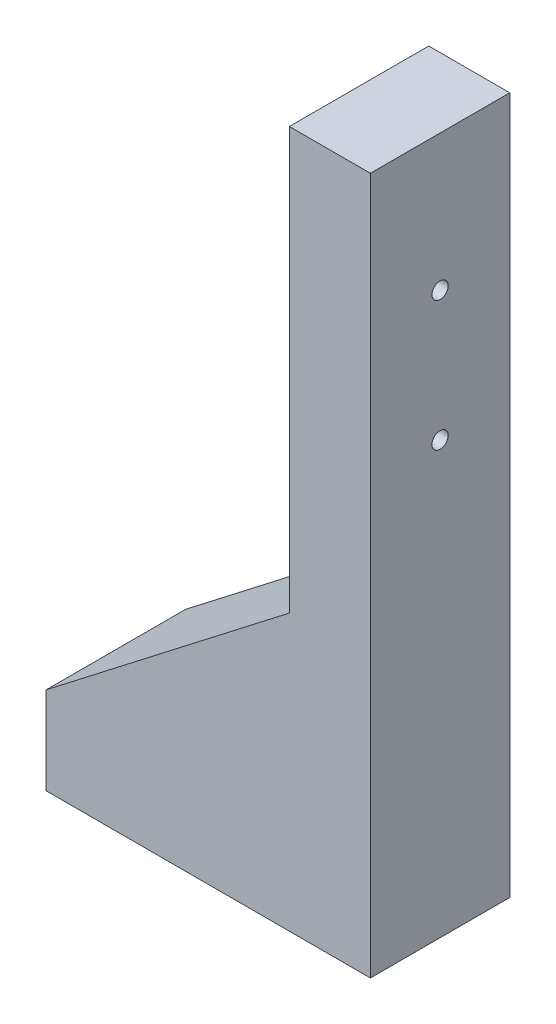
ISO-10303-21;
HEADER;
FILE_DESCRIPTION(('STEP AP214'),'2;1');
FILE_NAME('part.step','',(''),(''),'','','');
FILE_SCHEMA(('AUTOMOTIVE_DESIGN { 1 0 10303 214 1 1 1 1 }'));
ENDSEC;
DATA;
#1=APPLICATION_CONTEXT('core data for automotive mechanical design processes');
#2=APPLICATION_PROTOCOL_DEFINITION('international standard','automotive_design',2000,#1);
#3=PRODUCT_CONTEXT('',#1,'mechanical');
#4=PRODUCT('Part','Part','',(#3));
#5=PRODUCT_RELATED_PRODUCT_CATEGORY('part','',(#4));
#6=PRODUCT_DEFINITION_FORMATION('','',#4);
#7=PRODUCT_DEFINITION_CONTEXT('part definition',#1,'design');
#8=PRODUCT_DEFINITION('design','',#6,#7);
#9=PRODUCT_DEFINITION_SHAPE('','',#8);
#10=(LENGTH_UNIT() NAMED_UNIT(*) SI_UNIT(.MILLI.,.METRE.));
#11=(NAMED_UNIT(*) PLANE_ANGLE_UNIT() SI_UNIT($,.RADIAN.));
#12=(NAMED_UNIT(*) SI_UNIT($,.STERADIAN.) SOLID_ANGLE_UNIT());
#13=UNCERTAINTY_MEASURE_WITH_UNIT(LENGTH_MEASURE(1.E-05),#10,'distance_accuracy_value','');
#14=(GEOMETRIC_REPRESENTATION_CONTEXT(3) GLOBAL_UNCERTAINTY_ASSIGNED_CONTEXT((#13)) GLOBAL_UNIT_ASSIGNED_CONTEXT((#10,
#11,#12)) REPRESENTATION_CONTEXT('',''));
#15=CARTESIAN_POINT('',(0.,0.,0.));
#16=DIRECTION('',(0.,0.,1.));
#17=DIRECTION('',(1.,0.,0.));
#18=AXIS2_PLACEMENT_3D('',#15,#16,#17);
#19=CARTESIAN_POINT('',(-75.,-58.,43.));
#20=DIRECTION('',(0.611747641047043,-0.791052984112555,0.));
#21=DIRECTION('',(0.791052984112555,0.611747641047043,0.));
#22=AXIS2_PLACEMENT_3D('',#19,#20,#21);
#23=PLANE('',#22);
#24=DIRECTION('',(-0.791052984112555,-0.611747641047043,0.));
#25=VECTOR('',#24,1.);
#26=CARTESIAN_POINT('',(-75.,-58.,0.));
#27=LINE('',#26,#25);
#28=CARTESIAN_POINT('',(0.,0.,0.));
#29=VERTEX_POINT('',#28);
#30=CARTESIAN_POINT('',(-75.,-58.,0.));
#31=VERTEX_POINT('',#30);
#32=EDGE_CURVE('E117',#29,#31,#27,.T.);
#33=ORIENTED_EDGE('',*,*,#32,.T.);
#34=DIRECTION('',(0.,0.,-1.));
#35=VECTOR('',#34,1.);
#36=CARTESIAN_POINT('',(-75.,-58.,43.));
#37=LINE('',#36,#35);
#38=CARTESIAN_POINT('',(-75.,-58.,43.));
#39=VERTEX_POINT('',#38);
#40=EDGE_CURVE('E11',#39,#31,#37,.T.);
#41=ORIENTED_EDGE('',*,*,#40,.F.);
#42=DIRECTION('',(-0.791052984112555,-0.611747641047043,0.));
#43=VECTOR('',#42,1.);
#44=CARTESIAN_POINT('',(-75.,-58.,43.));
#45=LINE('',#44,#43);
#46=CARTESIAN_POINT('',(0.,0.,43.));
#47=VERTEX_POINT('',#46);
#48=EDGE_CURVE('E128',#47,#39,#45,.T.);
#49=ORIENTED_EDGE('',*,*,#48,.F.);
#50=DIRECTION('',(0.,0.,-1.));
#51=VECTOR('',#50,1.);
#52=CARTESIAN_POINT('',(0.,0.,43.));
#53=LINE('',#52,#51);
#54=EDGE_CURVE('E113',#47,#29,#53,.T.);
#55=ORIENTED_EDGE('',*,*,#54,.T.);
#56=EDGE_LOOP('',(#33,#41,#49,#55));
#57=FACE_BOUND('',#56,.T.);
#58=ADVANCED_FACE('F33',(#57),#23,.F.);
#59=CARTESIAN_POINT('',(-75.,-85.,43.));
#60=DIRECTION('',(1.,0.,0.));
#61=DIRECTION('',(0.,0.,-1.));
#62=AXIS2_PLACEMENT_3D('',#59,#60,#61);
#63=PLANE('',#62);
#64=DIRECTION('',(0.,-1.,0.));
#65=VECTOR('',#64,1.);
#66=CARTESIAN_POINT('',(-75.,-85.,0.));
#67=LINE('',#66,#65);
#68=CARTESIAN_POINT('',(-75.,-85.,0.));
#69=VERTEX_POINT('',#68);
#70=EDGE_CURVE('E120',#31,#69,#67,.T.);
#71=ORIENTED_EDGE('',*,*,#70,.T.);
#72=DIRECTION('',(0.,0.,-1.));
#73=VECTOR('',#72,1.);
#74=CARTESIAN_POINT('',(-75.,-85.,43.));
#75=LINE('',#74,#73);
#76=CARTESIAN_POINT('',(-75.,-85.,43.));
#77=VERTEX_POINT('',#76);
#78=EDGE_CURVE('E41',#77,#69,#75,.T.);
#79=ORIENTED_EDGE('',*,*,#78,.F.);
#80=DIRECTION('',(0.,-1.,0.));
#81=VECTOR('',#80,1.);
#82=CARTESIAN_POINT('',(-75.,-85.,43.));
#83=LINE('',#82,#81);
#84=EDGE_CURVE('E86',#39,#77,#83,.T.);
#85=ORIENTED_EDGE('',*,*,#84,.F.);
#86=ORIENTED_EDGE('',*,*,#40,.T.);
#87=EDGE_LOOP('',(#71,#79,#85,#86));
#88=FACE_BOUND('',#87,.T.);
#89=ADVANCED_FACE('F155',(#88),#63,.F.);
#90=CARTESIAN_POINT('',(25.,-85.,43.));
#91=DIRECTION('',(0.,1.,0.));
#92=DIRECTION('',(-1.,0.,0.));
#93=AXIS2_PLACEMENT_3D('',#90,#91,#92);
#94=PLANE('',#93);
#95=DIRECTION('',(1.,0.,0.));
#96=VECTOR('',#95,1.);
#97=CARTESIAN_POINT('',(25.,-85.,0.));
#98=LINE('',#97,#96);
#99=CARTESIAN_POINT('',(25.,-85.,0.));
#100=VERTEX_POINT('',#99);
#101=EDGE_CURVE('E123',#69,#100,#98,.T.);
#102=ORIENTED_EDGE('',*,*,#101,.T.);
#103=DIRECTION('',(0.,0.,-1.));
#104=VECTOR('',#103,1.);
#105=CARTESIAN_POINT('',(25.,-85.,43.));
#106=LINE('',#105,#104);
#107=CARTESIAN_POINT('',(25.,-85.,43.));
#108=VERTEX_POINT('',#107);
#109=EDGE_CURVE('E108',#108,#100,#106,.T.);
#110=ORIENTED_EDGE('',*,*,#109,.F.);
#111=DIRECTION('',(1.,0.,0.));
#112=VECTOR('',#111,1.);
#113=CARTESIAN_POINT('',(25.,-85.,43.));
#114=LINE('',#113,#112);
#115=EDGE_CURVE('E99',#77,#108,#114,.T.);
#116=ORIENTED_EDGE('',*,*,#115,.F.);
#117=ORIENTED_EDGE('',*,*,#78,.T.);
#118=EDGE_LOOP('',(#102,#110,#116,#117));
#119=FACE_BOUND('',#118,.T.);
#120=ADVANCED_FACE('F134',(#119),#94,.F.);
#121=CARTESIAN_POINT('',(25.,130.,43.));
#122=DIRECTION('',(-1.,0.,0.));
#123=DIRECTION('',(0.,-1.,0.));
#124=AXIS2_PLACEMENT_3D('',#121,#122,#123);
#125=PLANE('',#124);
#126=CARTESIAN_POINT('',(25.,88.,21.5));
#127=DIRECTION('',(-1.,0.,0.));
#128=DIRECTION('',(0.,0.,1.));
#129=AXIS2_PLACEMENT_3D('',#126,#127,#128);
#130=CIRCLE('',#129,2.5);
#131=CARTESIAN_POINT('',(25.,88.,24.));
#132=VERTEX_POINT('',#131);
#133=EDGE_CURVE('E121',#132,#132,#130,.T.);
#134=ORIENTED_EDGE('',*,*,#133,.T.);
#135=EDGE_LOOP('',(#134));
#136=FACE_BOUND('',#135,.T.);
#137=CARTESIAN_POINT('',(25.,48.,21.5));
#138=DIRECTION('',(-1.,0.,0.));
#139=DIRECTION('',(0.,0.,1.));
#140=AXIS2_PLACEMENT_3D('',#137,#138,#139);
#141=CIRCLE('',#140,2.5);
#142=CARTESIAN_POINT('',(25.,48.,24.));
#143=VERTEX_POINT('',#142);
#144=EDGE_CURVE('E173',#143,#143,#141,.T.);
#145=ORIENTED_EDGE('',*,*,#144,.T.);
#146=EDGE_LOOP('',(#145));
#147=FACE_BOUND('',#146,.T.);
#148=DIRECTION('',(0.,1.,0.));
#149=VECTOR('',#148,1.);
#150=CARTESIAN_POINT('',(25.,130.,0.));
#151=LINE('',#150,#149);
#152=CARTESIAN_POINT('',(25.,130.,0.));
#153=VERTEX_POINT('',#152);
#154=EDGE_CURVE('E107',#100,#153,#151,.T.);
#155=ORIENTED_EDGE('',*,*,#154,.T.);
#156=DIRECTION('',(0.,0.,-1.));
#157=VECTOR('',#156,1.);
#158=CARTESIAN_POINT('',(25.,130.,43.));
#159=LINE('',#158,#157);
#160=CARTESIAN_POINT('',(25.,130.,43.));
#161=VERTEX_POINT('',#160);
#162=EDGE_CURVE('E104',#161,#153,#159,.T.);
#163=ORIENTED_EDGE('',*,*,#162,.F.);
#164=DIRECTION('',(0.,1.,0.));
#165=VECTOR('',#164,1.);
#166=CARTESIAN_POINT('',(25.,130.,43.));
#167=LINE('',#166,#165);
#168=EDGE_CURVE('E93',#108,#161,#167,.T.);
#169=ORIENTED_EDGE('',*,*,#168,.F.);
#170=ORIENTED_EDGE('',*,*,#109,.T.);
#171=EDGE_LOOP('',(#155,#163,#169,#170));
#172=FACE_BOUND('',#171,.T.);
#173=ADVANCED_FACE('F105',(#136,#147,#172),#125,.F.);
#174=CARTESIAN_POINT('',(0.,130.,43.));
#175=DIRECTION('',(0.,-1.,0.));
#176=DIRECTION('',(0.,0.,-1.));
#177=AXIS2_PLACEMENT_3D('',#174,#175,#176);
#178=PLANE('',#177);
#179=DIRECTION('',(-1.,0.,0.));
#180=VECTOR('',#179,1.);
#181=CARTESIAN_POINT('',(0.,130.,0.));
#182=LINE('',#181,#180);
#183=CARTESIAN_POINT('',(0.,130.,0.));
#184=VERTEX_POINT('',#183);
#185=EDGE_CURVE('E72',#153,#184,#182,.T.);
#186=ORIENTED_EDGE('',*,*,#185,.T.);
#187=DIRECTION('',(0.,0.,-1.));
#188=VECTOR('',#187,1.);
#189=CARTESIAN_POINT('',(0.,130.,43.));
#190=LINE('',#189,#188);
#191=CARTESIAN_POINT('',(0.,130.,43.));
#192=VERTEX_POINT('',#191);
#193=EDGE_CURVE('E109',#192,#184,#190,.T.);
#194=ORIENTED_EDGE('',*,*,#193,.F.);
#195=DIRECTION('',(-1.,0.,0.));
#196=VECTOR('',#195,1.);
#197=CARTESIAN_POINT('',(0.,130.,43.));
#198=LINE('',#197,#196);
#199=EDGE_CURVE('E97',#161,#192,#198,.T.);
#200=ORIENTED_EDGE('',*,*,#199,.F.);
#201=ORIENTED_EDGE('',*,*,#162,.T.);
#202=EDGE_LOOP('',(#186,#194,#200,#201));
#203=FACE_BOUND('',#202,.T.);
#204=ADVANCED_FACE('F111',(#203),#178,.F.);
#205=CARTESIAN_POINT('',(0.,0.,43.));
#206=DIRECTION('',(1.,0.,0.));
#207=DIRECTION('',(0.,0.,-1.));
#208=AXIS2_PLACEMENT_3D('',#205,#206,#207);
#209=PLANE('',#208);
#210=CARTESIAN_POINT('',(0.,88.,21.5));
#211=DIRECTION('',(-1.,0.,0.));
#212=DIRECTION('',(0.,0.,1.));
#213=AXIS2_PLACEMENT_3D('',#210,#211,#212);
#214=CIRCLE('',#213,2.5);
#215=CARTESIAN_POINT('',(0.,88.,24.));
#216=VERTEX_POINT('',#215);
#217=EDGE_CURVE('E175',#216,#216,#214,.T.);
#218=ORIENTED_EDGE('',*,*,#217,.F.);
#219=EDGE_LOOP('',(#218));
#220=FACE_BOUND('',#219,.T.);
#221=CARTESIAN_POINT('',(0.,48.,21.5));
#222=DIRECTION('',(-1.,0.,0.));
#223=DIRECTION('',(0.,0.,1.));
#224=AXIS2_PLACEMENT_3D('',#221,#222,#223);
#225=CIRCLE('',#224,2.5);
#226=CARTESIAN_POINT('',(0.,48.,24.));
#227=VERTEX_POINT('',#226);
#228=EDGE_CURVE('E176',#227,#227,#225,.T.);
#229=ORIENTED_EDGE('',*,*,#228,.F.);
#230=EDGE_LOOP('',(#229));
#231=FACE_BOUND('',#230,.T.);
#232=DIRECTION('',(0.,-1.,0.));
#233=VECTOR('',#232,1.);
#234=CARTESIAN_POINT('',(0.,0.,0.));
#235=LINE('',#234,#233);
#236=EDGE_CURVE('E78',#184,#29,#235,.T.);
#237=ORIENTED_EDGE('',*,*,#236,.T.);
#238=ORIENTED_EDGE('',*,*,#54,.F.);
#239=DIRECTION('',(0.,-1.,0.));
#240=VECTOR('',#239,1.);
#241=CARTESIAN_POINT('',(0.,0.,43.));
#242=LINE('',#241,#240);
#243=EDGE_CURVE('E49',#192,#47,#242,.T.);
#244=ORIENTED_EDGE('',*,*,#243,.F.);
#245=ORIENTED_EDGE('',*,*,#193,.T.);
#246=EDGE_LOOP('',(#237,#238,#244,#245));
#247=FACE_BOUND('',#246,.T.);
#248=ADVANCED_FACE('F141',(#220,#231,#247),#209,.F.);
#249=CARTESIAN_POINT('',(0.,0.,43.));
#250=DIRECTION('',(0.,0.,1.));
#251=DIRECTION('',(1.,0.,0.));
#252=AXIS2_PLACEMENT_3D('',#249,#250,#251);
#253=PLANE('',#252);
#254=ORIENTED_EDGE('',*,*,#48,.T.);
#255=ORIENTED_EDGE('',*,*,#84,.T.);
#256=ORIENTED_EDGE('',*,*,#115,.T.);
#257=ORIENTED_EDGE('',*,*,#168,.T.);
#258=ORIENTED_EDGE('',*,*,#199,.T.);
#259=ORIENTED_EDGE('',*,*,#243,.T.);
#260=EDGE_LOOP('',(#254,#255,#256,#257,#258,#259));
#261=FACE_BOUND('',#260,.T.);
#262=ADVANCED_FACE('F95',(#261),#253,.T.);
#263=CARTESIAN_POINT('',(0.,0.,0.));
#264=DIRECTION('',(0.,0.,1.));
#265=DIRECTION('',(1.,0.,0.));
#266=AXIS2_PLACEMENT_3D('',#263,#264,#265);
#267=PLANE('',#266);
#268=ORIENTED_EDGE('',*,*,#32,.F.);
#269=ORIENTED_EDGE('',*,*,#236,.F.);
#270=ORIENTED_EDGE('',*,*,#185,.F.);
#271=ORIENTED_EDGE('',*,*,#154,.F.);
#272=ORIENTED_EDGE('',*,*,#101,.F.);
#273=ORIENTED_EDGE('',*,*,#70,.F.);
#274=EDGE_LOOP('',(#268,#269,#270,#271,#272,#273));
#275=FACE_BOUND('',#274,.T.);
#276=ADVANCED_FACE('F137',(#275),#267,.F.);
#277=CARTESIAN_POINT('',(25.,48.,21.5));
#278=DIRECTION('',(-1.,0.,0.));
#279=DIRECTION('',(0.,0.,1.));
#280=AXIS2_PLACEMENT_3D('',#277,#278,#279);
#281=CYLINDRICAL_SURFACE('',#280,2.5);
#282=ORIENTED_EDGE('',*,*,#144,.F.);
#283=EDGE_LOOP('',(#282));
#284=FACE_BOUND('',#283,.T.);
#285=ORIENTED_EDGE('',*,*,#228,.T.);
#286=EDGE_LOOP('',(#285));
#287=FACE_BOUND('',#286,.T.);
#288=ADVANCED_FACE('F187',(#284,#287),#281,.F.);
#289=CARTESIAN_POINT('',(25.,88.,21.5));
#290=DIRECTION('',(-1.,0.,0.));
#291=DIRECTION('',(0.,0.,1.));
#292=AXIS2_PLACEMENT_3D('',#289,#290,#291);
#293=CYLINDRICAL_SURFACE('',#292,2.5);
#294=ORIENTED_EDGE('',*,*,#133,.F.);
#295=EDGE_LOOP('',(#294));
#296=FACE_BOUND('',#295,.T.);
#297=ORIENTED_EDGE('',*,*,#217,.T.);
#298=EDGE_LOOP('',(#297));
#299=FACE_BOUND('',#298,.T.);
#300=ADVANCED_FACE('F189',(#296,#299),#293,.F.);
#301=CLOSED_SHELL('',(#58,#89,#120,#173,#204,#248,#262,#276,#288,#300));
#302=MANIFOLD_SOLID_BREP('B2',#301);
#303=ADVANCED_BREP_SHAPE_REPRESENTATION('',(#18,#302),#14);
#304=SHAPE_DEFINITION_REPRESENTATION(#9,#303);
ENDSEC;
END-ISO-10303-21;
